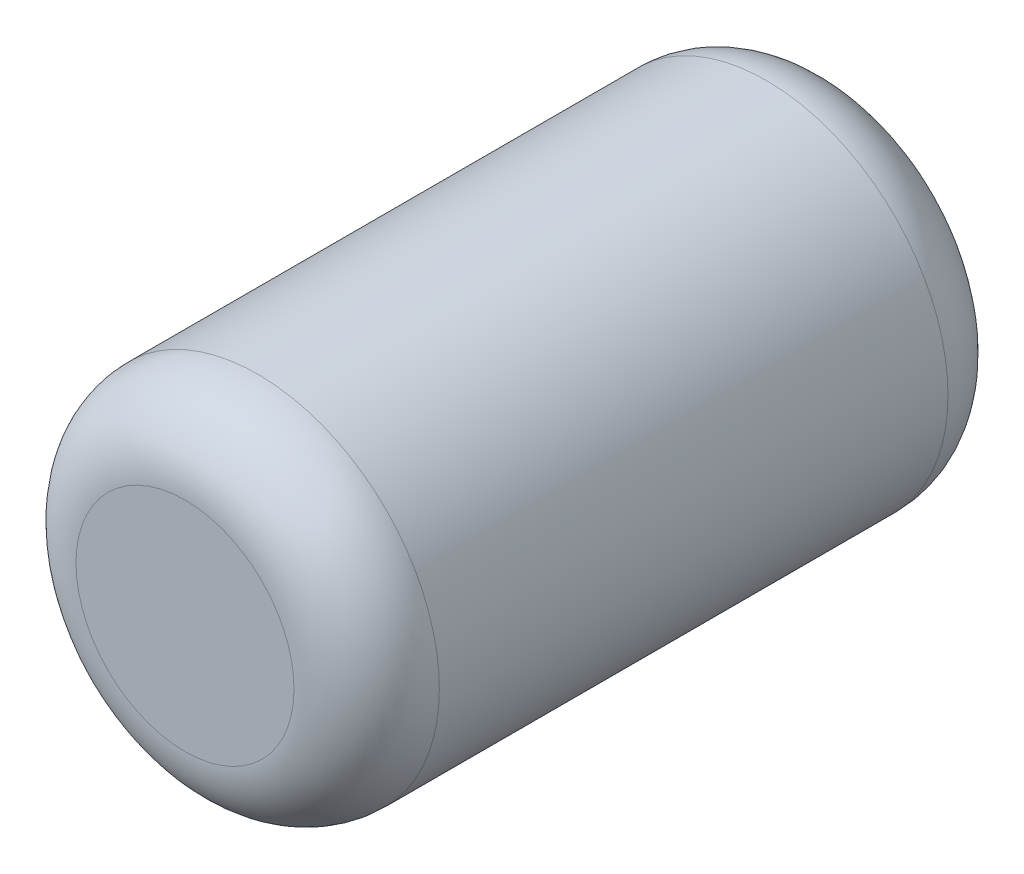
ISO-10303-21;
HEADER;
FILE_DESCRIPTION(('STEP AP214'),'2;1');
FILE_NAME('part.step','',(''),(''),'','','');
FILE_SCHEMA(('AUTOMOTIVE_DESIGN { 1 0 10303 214 1 1 1 1 }'));
ENDSEC;
DATA;
#1=APPLICATION_CONTEXT('core data for automotive mechanical design processes');
#2=APPLICATION_PROTOCOL_DEFINITION('international standard','automotive_design',2000,#1);
#3=PRODUCT_CONTEXT('',#1,'mechanical');
#4=PRODUCT('Part','Part','',(#3));
#5=PRODUCT_RELATED_PRODUCT_CATEGORY('part','',(#4));
#6=PRODUCT_DEFINITION_FORMATION('','',#4);
#7=PRODUCT_DEFINITION_CONTEXT('part definition',#1,'design');
#8=PRODUCT_DEFINITION('design','',#6,#7);
#9=PRODUCT_DEFINITION_SHAPE('','',#8);
#10=(LENGTH_UNIT() NAMED_UNIT(*) SI_UNIT(.MILLI.,.METRE.));
#11=(NAMED_UNIT(*) PLANE_ANGLE_UNIT() SI_UNIT($,.RADIAN.));
#12=(NAMED_UNIT(*) SI_UNIT($,.STERADIAN.) SOLID_ANGLE_UNIT());
#13=UNCERTAINTY_MEASURE_WITH_UNIT(LENGTH_MEASURE(1.E-05),#10,'distance_accuracy_value','');
#14=(GEOMETRIC_REPRESENTATION_CONTEXT(3) GLOBAL_UNCERTAINTY_ASSIGNED_CONTEXT((#13)) GLOBAL_UNIT_ASSIGNED_CONTEXT((#10,
#11,#12)) REPRESENTATION_CONTEXT('',''));
#15=CARTESIAN_POINT('',(0.,0.,0.));
#16=DIRECTION('',(0.,0.,1.));
#17=DIRECTION('',(1.,0.,0.));
#18=AXIS2_PLACEMENT_3D('',#15,#16,#17);
#19=CARTESIAN_POINT('',(0.,0.,228.6));
#20=DIRECTION('',(0.,0.,-1.));
#21=DIRECTION('',(-1.,0.,0.));
#22=AXIS2_PLACEMENT_3D('',#19,#20,#21);
#23=CYLINDRICAL_SURFACE('',#22,63.5);
#24=CARTESIAN_POINT('',(0.,0.,203.2));
#25=DIRECTION('',(0.,0.,1.));
#26=DIRECTION('',(1.,0.,0.));
#27=AXIS2_PLACEMENT_3D('',#24,#25,#26);
#28=CIRCLE('',#27,63.5);
#29=CARTESIAN_POINT('',(63.5,0.,203.2));
#30=VERTEX_POINT('',#29);
#31=EDGE_CURVE('E37',#30,#30,#28,.F.);
#32=ORIENTED_EDGE('',*,*,#31,.T.);
#33=EDGE_LOOP('',(#32));
#34=FACE_BOUND('',#33,.T.);
#35=CARTESIAN_POINT('',(0.,0.,25.4));
#36=DIRECTION('',(0.,0.,1.));
#37=DIRECTION('',(1.,0.,0.));
#38=AXIS2_PLACEMENT_3D('',#35,#36,#37);
#39=CIRCLE('',#38,63.5);
#40=CARTESIAN_POINT('',(63.5,0.,25.4));
#41=VERTEX_POINT('',#40);
#42=EDGE_CURVE('E41',#41,#41,#39,.T.);
#43=ORIENTED_EDGE('',*,*,#42,.T.);
#44=EDGE_LOOP('',(#43));
#45=FACE_BOUND('',#44,.T.);
#46=ADVANCED_FACE('F30',(#34,#45),#23,.T.);
#47=CARTESIAN_POINT('',(0.,0.,228.6));
#48=DIRECTION('',(0.,0.,1.));
#49=DIRECTION('',(1.,0.,0.));
#50=AXIS2_PLACEMENT_3D('',#47,#48,#49);
#51=PLANE('',#50);
#52=CARTESIAN_POINT('',(0.,0.,228.6));
#53=DIRECTION('',(0.,0.,1.));
#54=DIRECTION('',(1.,0.,0.));
#55=AXIS2_PLACEMENT_3D('',#52,#53,#54);
#56=CIRCLE('',#55,38.1);
#57=CARTESIAN_POINT('',(38.1,0.,228.6));
#58=VERTEX_POINT('',#57);
#59=EDGE_CURVE('E45',#58,#58,#56,.T.);
#60=ORIENTED_EDGE('',*,*,#59,.T.);
#61=EDGE_LOOP('',(#60));
#62=FACE_BOUND('',#61,.T.);
#63=ADVANCED_FACE('F51',(#62),#51,.T.);
#64=CARTESIAN_POINT('',(0.,0.,0.));
#65=DIRECTION('',(0.,0.,1.));
#66=DIRECTION('',(1.,0.,0.));
#67=AXIS2_PLACEMENT_3D('',#64,#65,#66);
#68=PLANE('',#67);
#69=CARTESIAN_POINT('',(0.,0.,0.));
#70=DIRECTION('',(0.,0.,1.));
#71=DIRECTION('',(1.,0.,0.));
#72=AXIS2_PLACEMENT_3D('',#69,#70,#71);
#73=CIRCLE('',#72,38.1);
#74=CARTESIAN_POINT('',(38.1,0.,0.));
#75=VERTEX_POINT('',#74);
#76=EDGE_CURVE('E10',#75,#75,#73,.F.);
#77=ORIENTED_EDGE('',*,*,#76,.T.);
#78=EDGE_LOOP('',(#77));
#79=FACE_BOUND('',#78,.T.);
#80=ADVANCED_FACE('F55',(#79),#68,.F.);
#81=CARTESIAN_POINT('',(0.,0.,203.2));
#82=DIRECTION('',(0.,0.,1.));
#83=DIRECTION('',(1.,0.,0.));
#84=AXIS2_PLACEMENT_3D('',#81,#82,#83);
#85=TOROIDAL_SURFACE('',#84,38.1,25.4);
#86=ORIENTED_EDGE('',*,*,#31,.F.);
#87=EDGE_LOOP('',(#86));
#88=FACE_BOUND('',#87,.T.);
#89=ORIENTED_EDGE('',*,*,#59,.F.);
#90=EDGE_LOOP('',(#89));
#91=FACE_BOUND('',#90,.T.);
#92=ADVANCED_FACE('F53',(#88,#91),#85,.T.);
#93=CARTESIAN_POINT('',(0.,0.,25.4));
#94=DIRECTION('',(0.,0.,1.));
#95=DIRECTION('',(1.,0.,0.));
#96=AXIS2_PLACEMENT_3D('',#93,#94,#95);
#97=TOROIDAL_SURFACE('',#96,38.1,25.4);
#98=ORIENTED_EDGE('',*,*,#76,.F.);
#99=EDGE_LOOP('',(#98));
#100=FACE_BOUND('',#99,.T.);
#101=ORIENTED_EDGE('',*,*,#42,.F.);
#102=EDGE_LOOP('',(#101));
#103=FACE_BOUND('',#102,.T.);
#104=ADVANCED_FACE('F32',(#100,#103),#97,.T.);
#105=CLOSED_SHELL('',(#46,#63,#80,#92,#104));
#106=MANIFOLD_SOLID_BREP('B2',#105);
#107=ADVANCED_BREP_SHAPE_REPRESENTATION('',(#18,#106),#14);
#108=SHAPE_DEFINITION_REPRESENTATION(#9,#107);
ENDSEC;
END-ISO-10303-21;
